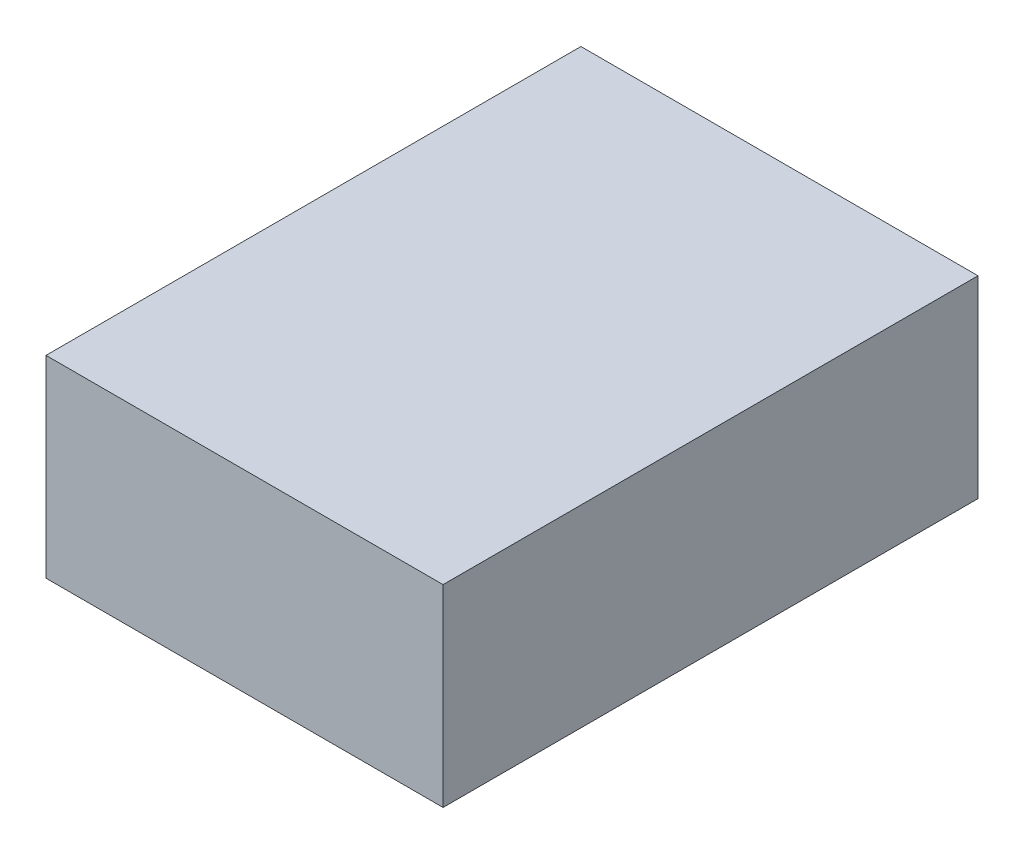
ISO-10303-21;
HEADER;
FILE_DESCRIPTION(('STEP AP214'),'2;1');
FILE_NAME('part.step','',(''),(''),'','','');
FILE_SCHEMA(('AUTOMOTIVE_DESIGN { 1 0 10303 214 1 1 1 1 }'));
ENDSEC;
DATA;
#1=APPLICATION_CONTEXT('core data for automotive mechanical design processes');
#2=APPLICATION_PROTOCOL_DEFINITION('international standard','automotive_design',2000,#1);
#3=PRODUCT_CONTEXT('',#1,'mechanical');
#4=PRODUCT('Part','Part','',(#3));
#5=PRODUCT_RELATED_PRODUCT_CATEGORY('part','',(#4));
#6=PRODUCT_DEFINITION_FORMATION('','',#4);
#7=PRODUCT_DEFINITION_CONTEXT('part definition',#1,'design');
#8=PRODUCT_DEFINITION('design','',#6,#7);
#9=PRODUCT_DEFINITION_SHAPE('','',#8);
#10=(LENGTH_UNIT() NAMED_UNIT(*) SI_UNIT(.MILLI.,.METRE.));
#11=(NAMED_UNIT(*) PLANE_ANGLE_UNIT() SI_UNIT($,.RADIAN.));
#12=(NAMED_UNIT(*) SI_UNIT($,.STERADIAN.) SOLID_ANGLE_UNIT());
#13=UNCERTAINTY_MEASURE_WITH_UNIT(LENGTH_MEASURE(1.E-05),#10,'distance_accuracy_value','');
#14=(GEOMETRIC_REPRESENTATION_CONTEXT(3) GLOBAL_UNCERTAINTY_ASSIGNED_CONTEXT((#13)) GLOBAL_UNIT_ASSIGNED_CONTEXT((#10,
#11,#12)) REPRESENTATION_CONTEXT('',''));
#15=CARTESIAN_POINT('',(0.,0.,0.));
#16=DIRECTION('',(0.,0.,1.));
#17=DIRECTION('',(1.,0.,0.));
#18=AXIS2_PLACEMENT_3D('',#15,#16,#17);
#19=CARTESIAN_POINT('',(0.,0.,0.));
#20=DIRECTION('',(0.,1.,0.));
#21=DIRECTION('',(0.,0.,1.));
#22=AXIS2_PLACEMENT_3D('',#19,#20,#21);
#23=PLANE('',#22);
#24=DIRECTION('',(1.,0.,0.));
#25=VECTOR('',#24,1.);
#26=CARTESIAN_POINT('',(0.,0.,0.97));
#27=LINE('',#26,#25);
#28=CARTESIAN_POINT('',(-0.72,0.,0.97));
#29=VERTEX_POINT('',#28);
#30=CARTESIAN_POINT('',(0.72,0.,0.97));
#31=VERTEX_POINT('',#30);
#32=EDGE_CURVE('E20',#29,#31,#27,.T.);
#33=ORIENTED_EDGE('',*,*,#32,.F.);
#34=DIRECTION('',(0.,0.,-1.));
#35=VECTOR('',#34,1.);
#36=CARTESIAN_POINT('',(-0.72,0.,-0.97));
#37=LINE('',#36,#35);
#38=CARTESIAN_POINT('',(-0.72,0.,-0.97));
#39=VERTEX_POINT('',#38);
#40=EDGE_CURVE('E69',#29,#39,#37,.T.);
#41=ORIENTED_EDGE('',*,*,#40,.T.);
#42=DIRECTION('',(1.,0.,0.));
#43=VECTOR('',#42,1.);
#44=CARTESIAN_POINT('',(-0.72,0.,-0.97));
#45=LINE('',#44,#43);
#46=CARTESIAN_POINT('',(0.72,0.,-0.97));
#47=VERTEX_POINT('',#46);
#48=EDGE_CURVE('E56',#39,#47,#45,.T.);
#49=ORIENTED_EDGE('',*,*,#48,.T.);
#50=DIRECTION('',(0.,0.,1.));
#51=VECTOR('',#50,1.);
#52=CARTESIAN_POINT('',(0.72,0.,-0.97));
#53=LINE('',#52,#51);
#54=EDGE_CURVE('E62',#47,#31,#53,.T.);
#55=ORIENTED_EDGE('',*,*,#54,.T.);
#56=EDGE_LOOP('',(#33,#41,#49,#55));
#57=FACE_BOUND('',#56,.T.);
#58=ADVANCED_FACE('F17',(#57),#23,.F.);
#59=CARTESIAN_POINT('',(0.72,0.7,-0.97));
#60=DIRECTION('',(-1.,0.,0.));
#61=DIRECTION('',(0.,0.,1.));
#62=AXIS2_PLACEMENT_3D('',#59,#60,#61);
#63=PLANE('',#62);
#64=DIRECTION('',(0.,1.,0.));
#65=VECTOR('',#64,1.);
#66=CARTESIAN_POINT('',(0.72,0.7,-0.97));
#67=LINE('',#66,#65);
#68=CARTESIAN_POINT('',(0.72,0.7,-0.97));
#69=VERTEX_POINT('',#68);
#70=EDGE_CURVE('E64',#47,#69,#67,.T.);
#71=ORIENTED_EDGE('',*,*,#70,.T.);
#72=DIRECTION('',(0.,0.,1.));
#73=VECTOR('',#72,1.);
#74=CARTESIAN_POINT('',(0.72,0.7,0.));
#75=LINE('',#74,#73);
#76=CARTESIAN_POINT('',(0.72,0.7,0.97));
#77=VERTEX_POINT('',#76);
#78=EDGE_CURVE('E83',#77,#69,#75,.F.);
#79=ORIENTED_EDGE('',*,*,#78,.F.);
#80=DIRECTION('',(0.,1.,0.));
#81=VECTOR('',#80,1.);
#82=CARTESIAN_POINT('',(0.72,0.7,0.97));
#83=LINE('',#82,#81);
#84=EDGE_CURVE('E67',#77,#31,#83,.F.);
#85=ORIENTED_EDGE('',*,*,#84,.T.);
#86=ORIENTED_EDGE('',*,*,#54,.F.);
#87=EDGE_LOOP('',(#71,#79,#85,#86));
#88=FACE_BOUND('',#87,.T.);
#89=ADVANCED_FACE('F63',(#88),#63,.F.);
#90=CARTESIAN_POINT('',(-0.72,0.7,-0.97));
#91=DIRECTION('',(0.,0.,1.));
#92=DIRECTION('',(1.,0.,0.));
#93=AXIS2_PLACEMENT_3D('',#90,#91,#92);
#94=PLANE('',#93);
#95=DIRECTION('',(0.,1.,0.));
#96=VECTOR('',#95,1.);
#97=CARTESIAN_POINT('',(-0.72,0.7,-0.97));
#98=LINE('',#97,#96);
#99=CARTESIAN_POINT('',(-0.72,0.7,-0.97));
#100=VERTEX_POINT('',#99);
#101=EDGE_CURVE('E71',#39,#100,#98,.T.);
#102=ORIENTED_EDGE('',*,*,#101,.T.);
#103=DIRECTION('',(1.,0.,0.));
#104=VECTOR('',#103,1.);
#105=CARTESIAN_POINT('',(0.,0.7,-0.97));
#106=LINE('',#105,#104);
#107=EDGE_CURVE('E75',#69,#100,#106,.F.);
#108=ORIENTED_EDGE('',*,*,#107,.F.);
#109=ORIENTED_EDGE('',*,*,#70,.F.);
#110=ORIENTED_EDGE('',*,*,#48,.F.);
#111=EDGE_LOOP('',(#102,#108,#109,#110));
#112=FACE_BOUND('',#111,.T.);
#113=ADVANCED_FACE('F73',(#112),#94,.F.);
#114=CARTESIAN_POINT('',(-0.72,0.7,-0.97));
#115=DIRECTION('',(1.,0.,0.));
#116=DIRECTION('',(0.,0.,-1.));
#117=AXIS2_PLACEMENT_3D('',#114,#115,#116);
#118=PLANE('',#117);
#119=DIRECTION('',(0.,1.,0.));
#120=VECTOR('',#119,1.);
#121=CARTESIAN_POINT('',(-0.72,0.7,0.97));
#122=LINE('',#121,#120);
#123=CARTESIAN_POINT('',(-0.72,0.7,0.97));
#124=VERTEX_POINT('',#123);
#125=EDGE_CURVE('E35',#29,#124,#122,.T.);
#126=ORIENTED_EDGE('',*,*,#125,.T.);
#127=DIRECTION('',(0.,0.,1.));
#128=VECTOR('',#127,1.);
#129=CARTESIAN_POINT('',(-0.72,0.7,0.));
#130=LINE('',#129,#128);
#131=EDGE_CURVE('E26',#100,#124,#130,.T.);
#132=ORIENTED_EDGE('',*,*,#131,.F.);
#133=ORIENTED_EDGE('',*,*,#101,.F.);
#134=ORIENTED_EDGE('',*,*,#40,.F.);
#135=EDGE_LOOP('',(#126,#132,#133,#134));
#136=FACE_BOUND('',#135,.T.);
#137=ADVANCED_FACE('F89',(#136),#118,.F.);
#138=CARTESIAN_POINT('',(-0.72,0.7,0.97));
#139=DIRECTION('',(0.,0.,-1.));
#140=DIRECTION('',(-1.,0.,0.));
#141=AXIS2_PLACEMENT_3D('',#138,#139,#140);
#142=PLANE('',#141);
#143=ORIENTED_EDGE('',*,*,#84,.F.);
#144=DIRECTION('',(1.,0.,0.));
#145=VECTOR('',#144,1.);
#146=CARTESIAN_POINT('',(0.,0.7,0.97));
#147=LINE('',#146,#145);
#148=EDGE_CURVE('E11',#124,#77,#147,.T.);
#149=ORIENTED_EDGE('',*,*,#148,.F.);
#150=ORIENTED_EDGE('',*,*,#125,.F.);
#151=ORIENTED_EDGE('',*,*,#32,.T.);
#152=EDGE_LOOP('',(#143,#149,#150,#151));
#153=FACE_BOUND('',#152,.T.);
#154=ADVANCED_FACE('F91',(#153),#142,.F.);
#155=CARTESIAN_POINT('',(0.,0.7,0.));
#156=DIRECTION('',(0.,1.,0.));
#157=DIRECTION('',(0.,0.,1.));
#158=AXIS2_PLACEMENT_3D('',#155,#156,#157);
#159=PLANE('',#158);
#160=ORIENTED_EDGE('',*,*,#131,.T.);
#161=ORIENTED_EDGE('',*,*,#148,.T.);
#162=ORIENTED_EDGE('',*,*,#78,.T.);
#163=ORIENTED_EDGE('',*,*,#107,.T.);
#164=EDGE_LOOP('',(#160,#161,#162,#163));
#165=FACE_BOUND('',#164,.T.);
#166=ADVANCED_FACE('F88',(#165),#159,.T.);
#167=CLOSED_SHELL('',(#58,#89,#113,#137,#154,#166));
#168=MANIFOLD_SOLID_BREP('B1',#167);
#169=ADVANCED_BREP_SHAPE_REPRESENTATION('',(#18,#168),#14);
#170=SHAPE_DEFINITION_REPRESENTATION(#9,#169);
ENDSEC;
END-ISO-10303-21;
